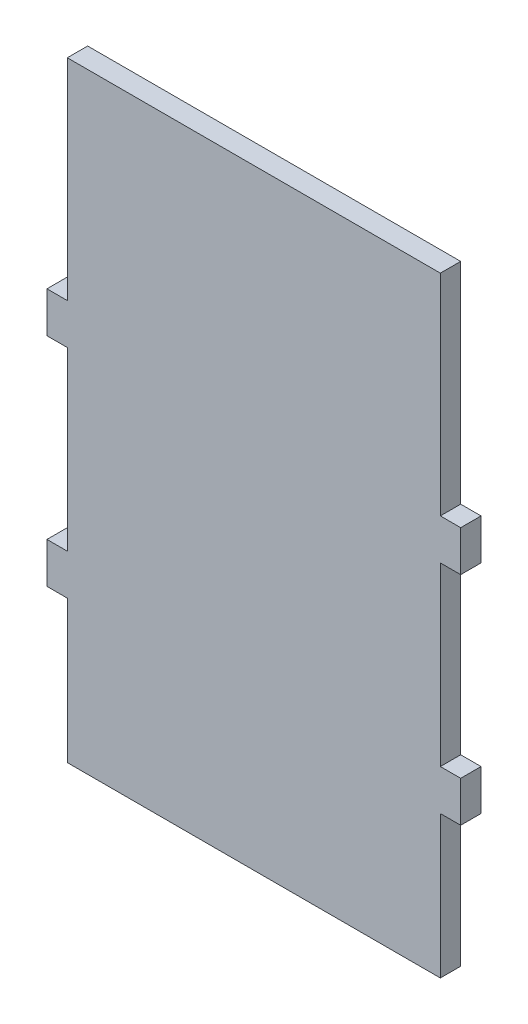
ISO-10303-21;
HEADER;
FILE_DESCRIPTION(('STEP AP214'),'2;1');
FILE_NAME('part.step','',(''),(''),'','','');
FILE_SCHEMA(('AUTOMOTIVE_DESIGN { 1 0 10303 214 1 1 1 1 }'));
ENDSEC;
DATA;
#1=APPLICATION_CONTEXT('core data for automotive mechanical design processes');
#2=APPLICATION_PROTOCOL_DEFINITION('international standard','automotive_design',2000,#1);
#3=PRODUCT_CONTEXT('',#1,'mechanical');
#4=PRODUCT('Part','Part','',(#3));
#5=PRODUCT_RELATED_PRODUCT_CATEGORY('part','',(#4));
#6=PRODUCT_DEFINITION_FORMATION('','',#4);
#7=PRODUCT_DEFINITION_CONTEXT('part definition',#1,'design');
#8=PRODUCT_DEFINITION('design','',#6,#7);
#9=PRODUCT_DEFINITION_SHAPE('','',#8);
#10=(LENGTH_UNIT() NAMED_UNIT(*) SI_UNIT(.MILLI.,.METRE.));
#11=(NAMED_UNIT(*) PLANE_ANGLE_UNIT() SI_UNIT($,.RADIAN.));
#12=(NAMED_UNIT(*) SI_UNIT($,.STERADIAN.) SOLID_ANGLE_UNIT());
#13=UNCERTAINTY_MEASURE_WITH_UNIT(LENGTH_MEASURE(1.E-05),#10,'distance_accuracy_value','');
#14=(GEOMETRIC_REPRESENTATION_CONTEXT(3) GLOBAL_UNCERTAINTY_ASSIGNED_CONTEXT((#13)) GLOBAL_UNIT_ASSIGNED_CONTEXT((#10,
#11,#12)) REPRESENTATION_CONTEXT('',''));
#15=CARTESIAN_POINT('',(0.,0.,0.));
#16=DIRECTION('',(0.,0.,1.));
#17=DIRECTION('',(1.,0.,0.));
#18=AXIS2_PLACEMENT_3D('',#15,#16,#17);
#19=CARTESIAN_POINT('',(0.,-31.,3.));
#20=DIRECTION('',(0.,-1.,0.));
#21=DIRECTION('',(0.,0.,-1.));
#22=AXIS2_PLACEMENT_3D('',#19,#20,#21);
#23=PLANE('',#22);
#24=DIRECTION('',(-1.,0.,0.));
#25=VECTOR('',#24,1.);
#26=CARTESIAN_POINT('',(0.,-31.,0.));
#27=LINE('',#26,#25);
#28=CARTESIAN_POINT('',(0.,-31.,0.));
#29=VERTEX_POINT('',#28);
#30=CARTESIAN_POINT('',(-3.,-31.,0.));
#31=VERTEX_POINT('',#30);
#32=EDGE_CURVE('E207',#29,#31,#27,.T.);
#33=ORIENTED_EDGE('',*,*,#32,.T.);
#34=DIRECTION('',(0.,0.,-1.));
#35=VECTOR('',#34,1.);
#36=CARTESIAN_POINT('',(-3.,-31.,3.));
#37=LINE('',#36,#35);
#38=CARTESIAN_POINT('',(-3.,-31.,3.));
#39=VERTEX_POINT('',#38);
#40=EDGE_CURVE('E11',#39,#31,#37,.T.);
#41=ORIENTED_EDGE('',*,*,#40,.F.);
#42=DIRECTION('',(-1.,0.,0.));
#43=VECTOR('',#42,1.);
#44=CARTESIAN_POINT('',(0.,-31.,3.));
#45=LINE('',#44,#43);
#46=CARTESIAN_POINT('',(0.,-31.,3.));
#47=VERTEX_POINT('',#46);
#48=EDGE_CURVE('E245',#47,#39,#45,.T.);
#49=ORIENTED_EDGE('',*,*,#48,.F.);
#50=DIRECTION('',(0.,0.,-1.));
#51=VECTOR('',#50,1.);
#52=CARTESIAN_POINT('',(0.,-31.,3.));
#53=LINE('',#52,#51);
#54=EDGE_CURVE('E203',#47,#29,#53,.T.);
#55=ORIENTED_EDGE('',*,*,#54,.T.);
#56=EDGE_LOOP('',(#33,#41,#49,#55));
#57=FACE_BOUND('',#56,.T.);
#58=ADVANCED_FACE('F39',(#57),#23,.F.);
#59=CARTESIAN_POINT('',(-3.,-31.,3.));
#60=DIRECTION('',(1.,0.,0.));
#61=DIRECTION('',(0.,1.,0.));
#62=AXIS2_PLACEMENT_3D('',#59,#60,#61);
#63=PLANE('',#62);
#64=DIRECTION('',(0.,-1.,0.));
#65=VECTOR('',#64,1.);
#66=CARTESIAN_POINT('',(-3.,-31.,0.));
#67=LINE('',#66,#65);
#68=CARTESIAN_POINT('',(-3.,-37.,0.));
#69=VERTEX_POINT('',#68);
#70=EDGE_CURVE('E210',#31,#69,#67,.T.);
#71=ORIENTED_EDGE('',*,*,#70,.T.);
#72=DIRECTION('',(0.,0.,-1.));
#73=VECTOR('',#72,1.);
#74=CARTESIAN_POINT('',(-3.,-37.,3.));
#75=LINE('',#74,#73);
#76=CARTESIAN_POINT('',(-3.,-37.,3.));
#77=VERTEX_POINT('',#76);
#78=EDGE_CURVE('E47',#77,#69,#75,.T.);
#79=ORIENTED_EDGE('',*,*,#78,.F.);
#80=DIRECTION('',(0.,-1.,0.));
#81=VECTOR('',#80,1.);
#82=CARTESIAN_POINT('',(-3.,-31.,3.));
#83=LINE('',#82,#81);
#84=EDGE_CURVE('E134',#39,#77,#83,.T.);
#85=ORIENTED_EDGE('',*,*,#84,.F.);
#86=ORIENTED_EDGE('',*,*,#40,.T.);
#87=EDGE_LOOP('',(#71,#79,#85,#86));
#88=FACE_BOUND('',#87,.T.);
#89=ADVANCED_FACE('F363',(#88),#63,.F.);
#90=CARTESIAN_POINT('',(0.,-37.,3.));
#91=DIRECTION('',(0.,1.,0.));
#92=DIRECTION('',(0.,0.,1.));
#93=AXIS2_PLACEMENT_3D('',#90,#91,#92);
#94=PLANE('',#93);
#95=DIRECTION('',(1.,0.,0.));
#96=VECTOR('',#95,1.);
#97=CARTESIAN_POINT('',(0.,-37.,0.));
#98=LINE('',#97,#96);
#99=CARTESIAN_POINT('',(0.,-37.,0.));
#100=VERTEX_POINT('',#99);
#101=EDGE_CURVE('E212',#69,#100,#98,.T.);
#102=ORIENTED_EDGE('',*,*,#101,.T.);
#103=DIRECTION('',(0.,0.,-1.));
#104=VECTOR('',#103,1.);
#105=CARTESIAN_POINT('',(0.,-37.,3.));
#106=LINE('',#105,#104);
#107=CARTESIAN_POINT('',(0.,-37.,3.));
#108=VERTEX_POINT('',#107);
#109=EDGE_CURVE('E288',#108,#100,#106,.T.);
#110=ORIENTED_EDGE('',*,*,#109,.F.);
#111=DIRECTION('',(1.,0.,0.));
#112=VECTOR('',#111,1.);
#113=CARTESIAN_POINT('',(0.,-37.,3.));
#114=LINE('',#113,#112);
#115=EDGE_CURVE('E296',#77,#108,#114,.T.);
#116=ORIENTED_EDGE('',*,*,#115,.F.);
#117=ORIENTED_EDGE('',*,*,#78,.T.);
#118=EDGE_LOOP('',(#102,#110,#116,#117));
#119=FACE_BOUND('',#118,.T.);
#120=ADVANCED_FACE('F294',(#119),#94,.F.);
#121=CARTESIAN_POINT('',(0.,-37.,3.));
#122=DIRECTION('',(1.,0.,0.));
#123=DIRECTION('',(0.,1.,0.));
#124=AXIS2_PLACEMENT_3D('',#121,#122,#123);
#125=PLANE('',#124);
#126=DIRECTION('',(0.,-1.,0.));
#127=VECTOR('',#126,1.);
#128=CARTESIAN_POINT('',(0.,-37.,0.));
#129=LINE('',#128,#127);
#130=CARTESIAN_POINT('',(0.,-63.,0.));
#131=VERTEX_POINT('',#130);
#132=EDGE_CURVE('E214',#100,#131,#129,.T.);
#133=ORIENTED_EDGE('',*,*,#132,.T.);
#134=DIRECTION('',(0.,0.,-1.));
#135=VECTOR('',#134,1.);
#136=CARTESIAN_POINT('',(0.,-63.,3.));
#137=LINE('',#136,#135);
#138=CARTESIAN_POINT('',(0.,-63.,3.));
#139=VERTEX_POINT('',#138);
#140=EDGE_CURVE('E285',#139,#131,#137,.T.);
#141=ORIENTED_EDGE('',*,*,#140,.F.);
#142=DIRECTION('',(0.,-1.,0.));
#143=VECTOR('',#142,1.);
#144=CARTESIAN_POINT('',(0.,-37.,3.));
#145=LINE('',#144,#143);
#146=EDGE_CURVE('E314',#108,#139,#145,.T.);
#147=ORIENTED_EDGE('',*,*,#146,.F.);
#148=ORIENTED_EDGE('',*,*,#109,.T.);
#149=EDGE_LOOP('',(#133,#141,#147,#148));
#150=FACE_BOUND('',#149,.T.);
#151=ADVANCED_FACE('F305',(#150),#125,.F.);
#152=CARTESIAN_POINT('',(0.,-63.,3.));
#153=DIRECTION('',(0.,-1.,0.));
#154=DIRECTION('',(0.,0.,-1.));
#155=AXIS2_PLACEMENT_3D('',#152,#153,#154);
#156=PLANE('',#155);
#157=DIRECTION('',(-1.,0.,0.));
#158=VECTOR('',#157,1.);
#159=CARTESIAN_POINT('',(0.,-63.,0.));
#160=LINE('',#159,#158);
#161=CARTESIAN_POINT('',(-3.,-63.,0.));
#162=VERTEX_POINT('',#161);
#163=EDGE_CURVE('E216',#131,#162,#160,.T.);
#164=ORIENTED_EDGE('',*,*,#163,.T.);
#165=DIRECTION('',(0.,0.,-1.));
#166=VECTOR('',#165,1.);
#167=CARTESIAN_POINT('',(-3.,-63.,3.));
#168=LINE('',#167,#166);
#169=CARTESIAN_POINT('',(-3.,-63.,3.));
#170=VERTEX_POINT('',#169);
#171=EDGE_CURVE('E282',#170,#162,#168,.T.);
#172=ORIENTED_EDGE('',*,*,#171,.F.);
#173=DIRECTION('',(-1.,0.,0.));
#174=VECTOR('',#173,1.);
#175=CARTESIAN_POINT('',(0.,-63.,3.));
#176=LINE('',#175,#174);
#177=EDGE_CURVE('E311',#139,#170,#176,.T.);
#178=ORIENTED_EDGE('',*,*,#177,.F.);
#179=ORIENTED_EDGE('',*,*,#140,.T.);
#180=EDGE_LOOP('',(#164,#172,#178,#179));
#181=FACE_BOUND('',#180,.T.);
#182=ADVANCED_FACE('F309',(#181),#156,.F.);
#183=CARTESIAN_POINT('',(-3.,-63.,3.));
#184=DIRECTION('',(1.,0.,0.));
#185=DIRECTION('',(0.,1.,0.));
#186=AXIS2_PLACEMENT_3D('',#183,#184,#185);
#187=PLANE('',#186);
#188=DIRECTION('',(0.,-1.,0.));
#189=VECTOR('',#188,1.);
#190=CARTESIAN_POINT('',(-3.,-63.,0.));
#191=LINE('',#190,#189);
#192=CARTESIAN_POINT('',(-2.99999999999999,-69.,0.));
#193=VERTEX_POINT('',#192);
#194=EDGE_CURVE('E218',#162,#193,#191,.T.);
#195=ORIENTED_EDGE('',*,*,#194,.T.);
#196=DIRECTION('',(0.,0.,-1.));
#197=VECTOR('',#196,1.);
#198=CARTESIAN_POINT('',(-2.99999999999999,-69.,3.));
#199=LINE('',#198,#197);
#200=CARTESIAN_POINT('',(-2.99999999999999,-69.,3.));
#201=VERTEX_POINT('',#200);
#202=EDGE_CURVE('E279',#201,#193,#199,.T.);
#203=ORIENTED_EDGE('',*,*,#202,.F.);
#204=DIRECTION('',(0.,-1.,0.));
#205=VECTOR('',#204,1.);
#206=CARTESIAN_POINT('',(-3.,-63.,3.));
#207=LINE('',#206,#205);
#208=EDGE_CURVE('E313',#170,#201,#207,.T.);
#209=ORIENTED_EDGE('',*,*,#208,.F.);
#210=ORIENTED_EDGE('',*,*,#171,.T.);
#211=EDGE_LOOP('',(#195,#203,#209,#210));
#212=FACE_BOUND('',#211,.T.);
#213=ADVANCED_FACE('F376',(#212),#187,.F.);
#214=CARTESIAN_POINT('',(0.,-69.,3.));
#215=DIRECTION('',(0.,1.,0.));
#216=DIRECTION('',(0.,0.,1.));
#217=AXIS2_PLACEMENT_3D('',#214,#215,#216);
#218=PLANE('',#217);
#219=DIRECTION('',(1.,0.,0.));
#220=VECTOR('',#219,1.);
#221=CARTESIAN_POINT('',(0.,-69.,0.));
#222=LINE('',#221,#220);
#223=CARTESIAN_POINT('',(0.,-69.,0.));
#224=VERTEX_POINT('',#223);
#225=EDGE_CURVE('E220',#193,#224,#222,.T.);
#226=ORIENTED_EDGE('',*,*,#225,.T.);
#227=DIRECTION('',(0.,0.,-1.));
#228=VECTOR('',#227,1.);
#229=CARTESIAN_POINT('',(0.,-69.,3.));
#230=LINE('',#229,#228);
#231=CARTESIAN_POINT('',(0.,-69.,3.));
#232=VERTEX_POINT('',#231);
#233=EDGE_CURVE('E276',#232,#224,#230,.T.);
#234=ORIENTED_EDGE('',*,*,#233,.F.);
#235=DIRECTION('',(1.,0.,0.));
#236=VECTOR('',#235,1.);
#237=CARTESIAN_POINT('',(0.,-69.,3.));
#238=LINE('',#237,#236);
#239=EDGE_CURVE('E316',#201,#232,#238,.T.);
#240=ORIENTED_EDGE('',*,*,#239,.F.);
#241=ORIENTED_EDGE('',*,*,#202,.T.);
#242=EDGE_LOOP('',(#226,#234,#240,#241));
#243=FACE_BOUND('',#242,.T.);
#244=ADVANCED_FACE('F379',(#243),#218,.F.);
#245=CARTESIAN_POINT('',(0.,-69.,3.));
#246=DIRECTION('',(1.,0.,0.));
#247=DIRECTION('',(0.,1.,0.));
#248=AXIS2_PLACEMENT_3D('',#245,#246,#247);
#249=PLANE('',#248);
#250=DIRECTION('',(0.,-1.,0.));
#251=VECTOR('',#250,1.);
#252=CARTESIAN_POINT('',(0.,-69.,0.));
#253=LINE('',#252,#251);
#254=CARTESIAN_POINT('',(0.,-90.,0.));
#255=VERTEX_POINT('',#254);
#256=EDGE_CURVE('E222',#224,#255,#253,.T.);
#257=ORIENTED_EDGE('',*,*,#256,.T.);
#258=DIRECTION('',(0.,0.,-1.));
#259=VECTOR('',#258,1.);
#260=CARTESIAN_POINT('',(0.,-90.,3.));
#261=LINE('',#260,#259);
#262=CARTESIAN_POINT('',(0.,-90.,3.));
#263=VERTEX_POINT('',#262);
#264=EDGE_CURVE('E273',#263,#255,#261,.T.);
#265=ORIENTED_EDGE('',*,*,#264,.F.);
#266=DIRECTION('',(0.,-1.,0.));
#267=VECTOR('',#266,1.);
#268=CARTESIAN_POINT('',(0.,-69.,3.));
#269=LINE('',#268,#267);
#270=EDGE_CURVE('E322',#232,#263,#269,.T.);
#271=ORIENTED_EDGE('',*,*,#270,.F.);
#272=ORIENTED_EDGE('',*,*,#233,.T.);
#273=EDGE_LOOP('',(#257,#265,#271,#272));
#274=FACE_BOUND('',#273,.T.);
#275=ADVANCED_FACE('F383',(#274),#249,.F.);
#276=CARTESIAN_POINT('',(0.,-90.,3.));
#277=DIRECTION('',(0.,1.,0.));
#278=DIRECTION('',(0.,0.,1.));
#279=AXIS2_PLACEMENT_3D('',#276,#277,#278);
#280=PLANE('',#279);
#281=DIRECTION('',(1.,0.,0.));
#282=VECTOR('',#281,1.);
#283=CARTESIAN_POINT('',(0.,-90.,0.));
#284=LINE('',#283,#282);
#285=CARTESIAN_POINT('',(55.,-90.,0.));
#286=VERTEX_POINT('',#285);
#287=EDGE_CURVE('E224',#255,#286,#284,.T.);
#288=ORIENTED_EDGE('',*,*,#287,.T.);
#289=DIRECTION('',(0.,0.,-1.));
#290=VECTOR('',#289,1.);
#291=CARTESIAN_POINT('',(55.,-90.,3.));
#292=LINE('',#291,#290);
#293=CARTESIAN_POINT('',(55.,-90.,3.));
#294=VERTEX_POINT('',#293);
#295=EDGE_CURVE('E270',#294,#286,#292,.T.);
#296=ORIENTED_EDGE('',*,*,#295,.F.);
#297=DIRECTION('',(1.,0.,0.));
#298=VECTOR('',#297,1.);
#299=CARTESIAN_POINT('',(0.,-90.,3.));
#300=LINE('',#299,#298);
#301=EDGE_CURVE('E324',#263,#294,#300,.T.);
#302=ORIENTED_EDGE('',*,*,#301,.F.);
#303=ORIENTED_EDGE('',*,*,#264,.T.);
#304=EDGE_LOOP('',(#288,#296,#302,#303));
#305=FACE_BOUND('',#304,.T.);
#306=ADVANCED_FACE('F387',(#305),#280,.F.);
#307=CARTESIAN_POINT('',(55.,-69.,3.));
#308=DIRECTION('',(-1.,0.,0.));
#309=DIRECTION('',(0.,-1.,0.));
#310=AXIS2_PLACEMENT_3D('',#307,#308,#309);
#311=PLANE('',#310);
#312=DIRECTION('',(0.,1.,0.));
#313=VECTOR('',#312,1.);
#314=CARTESIAN_POINT('',(55.,-69.,0.));
#315=LINE('',#314,#313);
#316=CARTESIAN_POINT('',(55.,-69.,0.));
#317=VERTEX_POINT('',#316);
#318=EDGE_CURVE('E226',#286,#317,#315,.T.);
#319=ORIENTED_EDGE('',*,*,#318,.T.);
#320=DIRECTION('',(0.,0.,-1.));
#321=VECTOR('',#320,1.);
#322=CARTESIAN_POINT('',(55.,-69.,3.));
#323=LINE('',#322,#321);
#324=CARTESIAN_POINT('',(55.,-69.,3.));
#325=VERTEX_POINT('',#324);
#326=EDGE_CURVE('E267',#325,#317,#323,.T.);
#327=ORIENTED_EDGE('',*,*,#326,.F.);
#328=DIRECTION('',(0.,1.,0.));
#329=VECTOR('',#328,1.);
#330=CARTESIAN_POINT('',(55.,-69.,3.));
#331=LINE('',#330,#329);
#332=EDGE_CURVE('E326',#294,#325,#331,.T.);
#333=ORIENTED_EDGE('',*,*,#332,.F.);
#334=ORIENTED_EDGE('',*,*,#295,.T.);
#335=EDGE_LOOP('',(#319,#327,#333,#334));
#336=FACE_BOUND('',#335,.T.);
#337=ADVANCED_FACE('F391',(#336),#311,.F.);
#338=CARTESIAN_POINT('',(55.,-69.,3.));
#339=DIRECTION('',(0.,1.,0.));
#340=DIRECTION('',(0.,0.,1.));
#341=AXIS2_PLACEMENT_3D('',#338,#339,#340);
#342=PLANE('',#341);
#343=DIRECTION('',(1.,0.,0.));
#344=VECTOR('',#343,1.);
#345=CARTESIAN_POINT('',(55.,-69.,0.));
#346=LINE('',#345,#344);
#347=CARTESIAN_POINT('',(58.,-69.,0.));
#348=VERTEX_POINT('',#347);
#349=EDGE_CURVE('E228',#317,#348,#346,.T.);
#350=ORIENTED_EDGE('',*,*,#349,.T.);
#351=DIRECTION('',(0.,0.,-1.));
#352=VECTOR('',#351,1.);
#353=CARTESIAN_POINT('',(58.,-69.,3.));
#354=LINE('',#353,#352);
#355=CARTESIAN_POINT('',(58.,-69.,3.));
#356=VERTEX_POINT('',#355);
#357=EDGE_CURVE('E264',#356,#348,#354,.T.);
#358=ORIENTED_EDGE('',*,*,#357,.F.);
#359=DIRECTION('',(1.,0.,0.));
#360=VECTOR('',#359,1.);
#361=CARTESIAN_POINT('',(55.,-69.,3.));
#362=LINE('',#361,#360);
#363=EDGE_CURVE('E328',#325,#356,#362,.T.);
#364=ORIENTED_EDGE('',*,*,#363,.F.);
#365=ORIENTED_EDGE('',*,*,#326,.T.);
#366=EDGE_LOOP('',(#350,#358,#364,#365));
#367=FACE_BOUND('',#366,.T.);
#368=ADVANCED_FACE('F395',(#367),#342,.F.);
#369=CARTESIAN_POINT('',(58.,-63.,3.));
#370=DIRECTION('',(-1.,0.,0.));
#371=DIRECTION('',(0.,0.,1.));
#372=AXIS2_PLACEMENT_3D('',#369,#370,#371);
#373=PLANE('',#372);
#374=DIRECTION('',(0.,1.,0.));
#375=VECTOR('',#374,1.);
#376=CARTESIAN_POINT('',(58.,-63.,0.));
#377=LINE('',#376,#375);
#378=CARTESIAN_POINT('',(58.,-63.,0.));
#379=VERTEX_POINT('',#378);
#380=EDGE_CURVE('E230',#348,#379,#377,.T.);
#381=ORIENTED_EDGE('',*,*,#380,.T.);
#382=DIRECTION('',(0.,0.,-1.));
#383=VECTOR('',#382,1.);
#384=CARTESIAN_POINT('',(58.,-63.,3.));
#385=LINE('',#384,#383);
#386=CARTESIAN_POINT('',(58.,-63.,3.));
#387=VERTEX_POINT('',#386);
#388=EDGE_CURVE('E261',#387,#379,#385,.T.);
#389=ORIENTED_EDGE('',*,*,#388,.F.);
#390=DIRECTION('',(0.,1.,0.));
#391=VECTOR('',#390,1.);
#392=CARTESIAN_POINT('',(58.,-63.,3.));
#393=LINE('',#392,#391);
#394=EDGE_CURVE('E330',#356,#387,#393,.T.);
#395=ORIENTED_EDGE('',*,*,#394,.F.);
#396=ORIENTED_EDGE('',*,*,#357,.T.);
#397=EDGE_LOOP('',(#381,#389,#395,#396));
#398=FACE_BOUND('',#397,.T.);
#399=ADVANCED_FACE('F399',(#398),#373,.F.);
#400=CARTESIAN_POINT('',(55.,-63.,3.));
#401=DIRECTION('',(0.,-1.,0.));
#402=DIRECTION('',(0.,0.,-1.));
#403=AXIS2_PLACEMENT_3D('',#400,#401,#402);
#404=PLANE('',#403);
#405=DIRECTION('',(-1.,0.,0.));
#406=VECTOR('',#405,1.);
#407=CARTESIAN_POINT('',(55.,-63.,0.));
#408=LINE('',#407,#406);
#409=CARTESIAN_POINT('',(55.,-63.,0.));
#410=VERTEX_POINT('',#409);
#411=EDGE_CURVE('E232',#379,#410,#408,.T.);
#412=ORIENTED_EDGE('',*,*,#411,.T.);
#413=DIRECTION('',(0.,0.,-1.));
#414=VECTOR('',#413,1.);
#415=CARTESIAN_POINT('',(55.,-63.,3.));
#416=LINE('',#415,#414);
#417=CARTESIAN_POINT('',(55.,-63.,3.));
#418=VERTEX_POINT('',#417);
#419=EDGE_CURVE('E258',#418,#410,#416,.T.);
#420=ORIENTED_EDGE('',*,*,#419,.F.);
#421=DIRECTION('',(-1.,0.,0.));
#422=VECTOR('',#421,1.);
#423=CARTESIAN_POINT('',(55.,-63.,3.));
#424=LINE('',#423,#422);
#425=EDGE_CURVE('E332',#387,#418,#424,.T.);
#426=ORIENTED_EDGE('',*,*,#425,.F.);
#427=ORIENTED_EDGE('',*,*,#388,.T.);
#428=EDGE_LOOP('',(#412,#420,#426,#427));
#429=FACE_BOUND('',#428,.T.);
#430=ADVANCED_FACE('F403',(#429),#404,.F.);
#431=CARTESIAN_POINT('',(55.,-37.,3.));
#432=DIRECTION('',(-1.,0.,0.));
#433=DIRECTION('',(0.,-1.,0.));
#434=AXIS2_PLACEMENT_3D('',#431,#432,#433);
#435=PLANE('',#434);
#436=DIRECTION('',(0.,1.,0.));
#437=VECTOR('',#436,1.);
#438=CARTESIAN_POINT('',(55.,-37.,0.));
#439=LINE('',#438,#437);
#440=CARTESIAN_POINT('',(55.,-37.,0.));
#441=VERTEX_POINT('',#440);
#442=EDGE_CURVE('E234',#410,#441,#439,.T.);
#443=ORIENTED_EDGE('',*,*,#442,.T.);
#444=DIRECTION('',(0.,0.,-1.));
#445=VECTOR('',#444,1.);
#446=CARTESIAN_POINT('',(55.,-37.,3.));
#447=LINE('',#446,#445);
#448=CARTESIAN_POINT('',(55.,-37.,3.));
#449=VERTEX_POINT('',#448);
#450=EDGE_CURVE('E255',#449,#441,#447,.T.);
#451=ORIENTED_EDGE('',*,*,#450,.F.);
#452=DIRECTION('',(0.,1.,0.));
#453=VECTOR('',#452,1.);
#454=CARTESIAN_POINT('',(55.,-37.,3.));
#455=LINE('',#454,#453);
#456=EDGE_CURVE('E334',#418,#449,#455,.T.);
#457=ORIENTED_EDGE('',*,*,#456,.F.);
#458=ORIENTED_EDGE('',*,*,#419,.T.);
#459=EDGE_LOOP('',(#443,#451,#457,#458));
#460=FACE_BOUND('',#459,.T.);
#461=ADVANCED_FACE('F407',(#460),#435,.F.);
#462=CARTESIAN_POINT('',(55.,-37.,3.));
#463=DIRECTION('',(0.,1.,0.));
#464=DIRECTION('',(0.,0.,1.));
#465=AXIS2_PLACEMENT_3D('',#462,#463,#464);
#466=PLANE('',#465);
#467=DIRECTION('',(1.,0.,0.));
#468=VECTOR('',#467,1.);
#469=CARTESIAN_POINT('',(55.,-37.,0.));
#470=LINE('',#469,#468);
#471=CARTESIAN_POINT('',(58.,-37.,0.));
#472=VERTEX_POINT('',#471);
#473=EDGE_CURVE('E236',#441,#472,#470,.T.);
#474=ORIENTED_EDGE('',*,*,#473,.T.);
#475=DIRECTION('',(0.,0.,-1.));
#476=VECTOR('',#475,1.);
#477=CARTESIAN_POINT('',(58.,-37.,3.));
#478=LINE('',#477,#476);
#479=CARTESIAN_POINT('',(58.,-37.,3.));
#480=VERTEX_POINT('',#479);
#481=EDGE_CURVE('E252',#480,#472,#478,.T.);
#482=ORIENTED_EDGE('',*,*,#481,.F.);
#483=DIRECTION('',(1.,0.,0.));
#484=VECTOR('',#483,1.);
#485=CARTESIAN_POINT('',(55.,-37.,3.));
#486=LINE('',#485,#484);
#487=EDGE_CURVE('E336',#449,#480,#486,.T.);
#488=ORIENTED_EDGE('',*,*,#487,.F.);
#489=ORIENTED_EDGE('',*,*,#450,.T.);
#490=EDGE_LOOP('',(#474,#482,#488,#489));
#491=FACE_BOUND('',#490,.T.);
#492=ADVANCED_FACE('F411',(#491),#466,.F.);
#493=CARTESIAN_POINT('',(58.,-31.,3.));
#494=DIRECTION('',(-1.,0.,0.));
#495=DIRECTION('',(0.,0.,1.));
#496=AXIS2_PLACEMENT_3D('',#493,#494,#495);
#497=PLANE('',#496);
#498=DIRECTION('',(0.,1.,0.));
#499=VECTOR('',#498,1.);
#500=CARTESIAN_POINT('',(58.,-31.,0.));
#501=LINE('',#500,#499);
#502=CARTESIAN_POINT('',(58.,-31.,0.));
#503=VERTEX_POINT('',#502);
#504=EDGE_CURVE('E238',#472,#503,#501,.T.);
#505=ORIENTED_EDGE('',*,*,#504,.T.);
#506=DIRECTION('',(0.,0.,-1.));
#507=VECTOR('',#506,1.);
#508=CARTESIAN_POINT('',(58.,-31.,3.));
#509=LINE('',#508,#507);
#510=CARTESIAN_POINT('',(58.,-31.,3.));
#511=VERTEX_POINT('',#510);
#512=EDGE_CURVE('E249',#511,#503,#509,.T.);
#513=ORIENTED_EDGE('',*,*,#512,.F.);
#514=DIRECTION('',(0.,1.,0.));
#515=VECTOR('',#514,1.);
#516=CARTESIAN_POINT('',(58.,-31.,3.));
#517=LINE('',#516,#515);
#518=EDGE_CURVE('E338',#480,#511,#517,.T.);
#519=ORIENTED_EDGE('',*,*,#518,.F.);
#520=ORIENTED_EDGE('',*,*,#481,.T.);
#521=EDGE_LOOP('',(#505,#513,#519,#520));
#522=FACE_BOUND('',#521,.T.);
#523=ADVANCED_FACE('F344',(#522),#497,.F.);
#524=CARTESIAN_POINT('',(55.,-31.,3.));
#525=DIRECTION('',(0.,-1.,0.));
#526=DIRECTION('',(0.,0.,-1.));
#527=AXIS2_PLACEMENT_3D('',#524,#525,#526);
#528=PLANE('',#527);
#529=DIRECTION('',(-1.,0.,0.));
#530=VECTOR('',#529,1.);
#531=CARTESIAN_POINT('',(55.,-31.,0.));
#532=LINE('',#531,#530);
#533=CARTESIAN_POINT('',(55.,-31.,0.));
#534=VERTEX_POINT('',#533);
#535=EDGE_CURVE('E240',#503,#534,#532,.T.);
#536=ORIENTED_EDGE('',*,*,#535,.T.);
#537=DIRECTION('',(0.,0.,-1.));
#538=VECTOR('',#537,1.);
#539=CARTESIAN_POINT('',(55.,-31.,3.));
#540=LINE('',#539,#538);
#541=CARTESIAN_POINT('',(55.,-31.,3.));
#542=VERTEX_POINT('',#541);
#543=EDGE_CURVE('E198',#542,#534,#540,.T.);
#544=ORIENTED_EDGE('',*,*,#543,.F.);
#545=DIRECTION('',(-1.,0.,0.));
#546=VECTOR('',#545,1.);
#547=CARTESIAN_POINT('',(55.,-31.,3.));
#548=LINE('',#547,#546);
#549=EDGE_CURVE('E189',#511,#542,#548,.T.);
#550=ORIENTED_EDGE('',*,*,#549,.F.);
#551=ORIENTED_EDGE('',*,*,#512,.T.);
#552=EDGE_LOOP('',(#536,#544,#550,#551));
#553=FACE_BOUND('',#552,.T.);
#554=ADVANCED_FACE('F348',(#553),#528,.F.);
#555=CARTESIAN_POINT('',(55.,0.,3.));
#556=DIRECTION('',(-1.,0.,0.));
#557=DIRECTION('',(0.,0.,1.));
#558=AXIS2_PLACEMENT_3D('',#555,#556,#557);
#559=PLANE('',#558);
#560=DIRECTION('',(0.,1.,0.));
#561=VECTOR('',#560,1.);
#562=CARTESIAN_POINT('',(55.,0.,0.));
#563=LINE('',#562,#561);
#564=CARTESIAN_POINT('',(55.,0.,0.));
#565=VERTEX_POINT('',#564);
#566=EDGE_CURVE('E197',#534,#565,#563,.T.);
#567=ORIENTED_EDGE('',*,*,#566,.T.);
#568=DIRECTION('',(0.,0.,-1.));
#569=VECTOR('',#568,1.);
#570=CARTESIAN_POINT('',(55.,0.,3.));
#571=LINE('',#570,#569);
#572=CARTESIAN_POINT('',(55.,0.,3.));
#573=VERTEX_POINT('',#572);
#574=EDGE_CURVE('E194',#573,#565,#571,.T.);
#575=ORIENTED_EDGE('',*,*,#574,.F.);
#576=DIRECTION('',(0.,1.,0.));
#577=VECTOR('',#576,1.);
#578=CARTESIAN_POINT('',(55.,0.,3.));
#579=LINE('',#578,#577);
#580=EDGE_CURVE('E183',#542,#573,#579,.T.);
#581=ORIENTED_EDGE('',*,*,#580,.F.);
#582=ORIENTED_EDGE('',*,*,#543,.T.);
#583=EDGE_LOOP('',(#567,#575,#581,#582));
#584=FACE_BOUND('',#583,.T.);
#585=ADVANCED_FACE('F195',(#584),#559,.F.);
#586=CARTESIAN_POINT('',(0.,0.,3.));
#587=DIRECTION('',(0.,-1.,0.));
#588=DIRECTION('',(0.,0.,-1.));
#589=AXIS2_PLACEMENT_3D('',#586,#587,#588);
#590=PLANE('',#589);
#591=DIRECTION('',(-1.,0.,0.));
#592=VECTOR('',#591,1.);
#593=CARTESIAN_POINT('',(0.,0.,0.));
#594=LINE('',#593,#592);
#595=CARTESIAN_POINT('',(0.,0.,0.));
#596=VERTEX_POINT('',#595);
#597=EDGE_CURVE('E120',#565,#596,#594,.T.);
#598=ORIENTED_EDGE('',*,*,#597,.T.);
#599=DIRECTION('',(0.,0.,-1.));
#600=VECTOR('',#599,1.);
#601=CARTESIAN_POINT('',(0.,0.,3.));
#602=LINE('',#601,#600);
#603=CARTESIAN_POINT('',(0.,0.,3.));
#604=VERTEX_POINT('',#603);
#605=EDGE_CURVE('E199',#604,#596,#602,.T.);
#606=ORIENTED_EDGE('',*,*,#605,.F.);
#607=DIRECTION('',(-1.,0.,0.));
#608=VECTOR('',#607,1.);
#609=CARTESIAN_POINT('',(0.,0.,3.));
#610=LINE('',#609,#608);
#611=EDGE_CURVE('E187',#573,#604,#610,.T.);
#612=ORIENTED_EDGE('',*,*,#611,.F.);
#613=ORIENTED_EDGE('',*,*,#574,.T.);
#614=EDGE_LOOP('',(#598,#606,#612,#613));
#615=FACE_BOUND('',#614,.T.);
#616=ADVANCED_FACE('F201',(#615),#590,.F.);
#617=CARTESIAN_POINT('',(0.,0.,3.));
#618=DIRECTION('',(1.,0.,0.));
#619=DIRECTION('',(0.,1.,0.));
#620=AXIS2_PLACEMENT_3D('',#617,#618,#619);
#621=PLANE('',#620);
#622=DIRECTION('',(0.,-1.,0.));
#623=VECTOR('',#622,1.);
#624=CARTESIAN_POINT('',(0.,0.,0.));
#625=LINE('',#624,#623);
#626=EDGE_CURVE('E126',#596,#29,#625,.T.);
#627=ORIENTED_EDGE('',*,*,#626,.T.);
#628=ORIENTED_EDGE('',*,*,#54,.F.);
#629=DIRECTION('',(0.,-1.,0.));
#630=VECTOR('',#629,1.);
#631=CARTESIAN_POINT('',(0.,0.,3.));
#632=LINE('',#631,#630);
#633=EDGE_CURVE('E55',#604,#47,#632,.T.);
#634=ORIENTED_EDGE('',*,*,#633,.F.);
#635=ORIENTED_EDGE('',*,*,#605,.T.);
#636=EDGE_LOOP('',(#627,#628,#634,#635));
#637=FACE_BOUND('',#636,.T.);
#638=ADVANCED_FACE('F352',(#637),#621,.F.);
#639=CARTESIAN_POINT('',(0.,0.,3.));
#640=DIRECTION('',(0.,0.,1.));
#641=DIRECTION('',(1.,0.,0.));
#642=AXIS2_PLACEMENT_3D('',#639,#640,#641);
#643=PLANE('',#642);
#644=ORIENTED_EDGE('',*,*,#48,.T.);
#645=ORIENTED_EDGE('',*,*,#84,.T.);
#646=ORIENTED_EDGE('',*,*,#115,.T.);
#647=ORIENTED_EDGE('',*,*,#146,.T.);
#648=ORIENTED_EDGE('',*,*,#177,.T.);
#649=ORIENTED_EDGE('',*,*,#208,.T.);
#650=ORIENTED_EDGE('',*,*,#239,.T.);
#651=ORIENTED_EDGE('',*,*,#270,.T.);
#652=ORIENTED_EDGE('',*,*,#301,.T.);
#653=ORIENTED_EDGE('',*,*,#332,.T.);
#654=ORIENTED_EDGE('',*,*,#363,.T.);
#655=ORIENTED_EDGE('',*,*,#394,.T.);
#656=ORIENTED_EDGE('',*,*,#425,.T.);
#657=ORIENTED_EDGE('',*,*,#456,.T.);
#658=ORIENTED_EDGE('',*,*,#487,.T.);
#659=ORIENTED_EDGE('',*,*,#518,.T.);
#660=ORIENTED_EDGE('',*,*,#549,.T.);
#661=ORIENTED_EDGE('',*,*,#580,.T.);
#662=ORIENTED_EDGE('',*,*,#611,.T.);
#663=ORIENTED_EDGE('',*,*,#633,.T.);
#664=EDGE_LOOP('',(#644,#645,#646,#647,#648,#649,#650,#651,#652,#653,#654,#655,#656,#657,#658,
#659,#660,#661,#662,#663));
#665=FACE_BOUND('',#664,.T.);
#666=ADVANCED_FACE('F185',(#665),#643,.T.);
#667=CARTESIAN_POINT('',(0.,0.,0.));
#668=DIRECTION('',(0.,0.,1.));
#669=DIRECTION('',(1.,0.,0.));
#670=AXIS2_PLACEMENT_3D('',#667,#668,#669);
#671=PLANE('',#670);
#672=ORIENTED_EDGE('',*,*,#32,.F.);
#673=ORIENTED_EDGE('',*,*,#626,.F.);
#674=ORIENTED_EDGE('',*,*,#597,.F.);
#675=ORIENTED_EDGE('',*,*,#566,.F.);
#676=ORIENTED_EDGE('',*,*,#535,.F.);
#677=ORIENTED_EDGE('',*,*,#504,.F.);
#678=ORIENTED_EDGE('',*,*,#473,.F.);
#679=ORIENTED_EDGE('',*,*,#442,.F.);
#680=ORIENTED_EDGE('',*,*,#411,.F.);
#681=ORIENTED_EDGE('',*,*,#380,.F.);
#682=ORIENTED_EDGE('',*,*,#349,.F.);
#683=ORIENTED_EDGE('',*,*,#318,.F.);
#684=ORIENTED_EDGE('',*,*,#287,.F.);
#685=ORIENTED_EDGE('',*,*,#256,.F.);
#686=ORIENTED_EDGE('',*,*,#225,.F.);
#687=ORIENTED_EDGE('',*,*,#194,.F.);
#688=ORIENTED_EDGE('',*,*,#163,.F.);
#689=ORIENTED_EDGE('',*,*,#132,.F.);
#690=ORIENTED_EDGE('',*,*,#101,.F.);
#691=ORIENTED_EDGE('',*,*,#70,.F.);
#692=EDGE_LOOP('',(#672,#673,#674,#675,#676,#677,#678,#679,#680,#681,#682,#683,#684,#685,#686,
#687,#688,#689,#690,#691));
#693=FACE_BOUND('',#692,.T.);
#694=ADVANCED_FACE('F300',(#693),#671,.F.);
#695=CLOSED_SHELL('',(#58,#89,#120,#151,#182,#213,#244,#275,#306,#337,#368,#399,#430,#461,#492,
#523,#554,#585,#616,#638,#666,#694));
#696=MANIFOLD_SOLID_BREP('B2',#695);
#697=ADVANCED_BREP_SHAPE_REPRESENTATION('',(#18,#696),#14);
#698=SHAPE_DEFINITION_REPRESENTATION(#9,#697);
ENDSEC;
END-ISO-10303-21;
